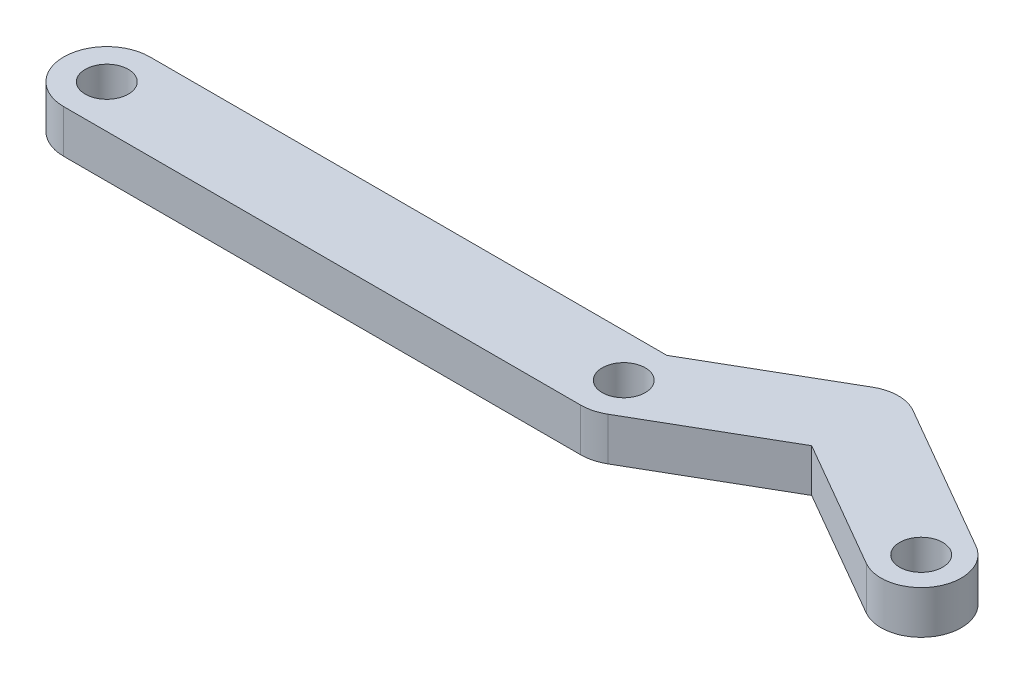
ISO-10303-21;
HEADER;
FILE_DESCRIPTION(('STEP AP214'),'2;1');
FILE_NAME('part.step','',(''),(''),'','','');
FILE_SCHEMA(('AUTOMOTIVE_DESIGN { 1 0 10303 214 1 1 1 1 }'));
ENDSEC;
DATA;
#1=APPLICATION_CONTEXT('core data for automotive mechanical design processes');
#2=APPLICATION_PROTOCOL_DEFINITION('international standard','automotive_design',2000,#1);
#3=PRODUCT_CONTEXT('',#1,'mechanical');
#4=PRODUCT('Part','Part','',(#3));
#5=PRODUCT_RELATED_PRODUCT_CATEGORY('part','',(#4));
#6=PRODUCT_DEFINITION_FORMATION('','',#4);
#7=PRODUCT_DEFINITION_CONTEXT('part definition',#1,'design');
#8=PRODUCT_DEFINITION('design','',#6,#7);
#9=PRODUCT_DEFINITION_SHAPE('','',#8);
#10=(LENGTH_UNIT() NAMED_UNIT(*) SI_UNIT(.MILLI.,.METRE.));
#11=(NAMED_UNIT(*) PLANE_ANGLE_UNIT() SI_UNIT($,.RADIAN.));
#12=(NAMED_UNIT(*) SI_UNIT($,.STERADIAN.) SOLID_ANGLE_UNIT());
#13=UNCERTAINTY_MEASURE_WITH_UNIT(LENGTH_MEASURE(1.E-05),#10,'distance_accuracy_value','');
#14=(GEOMETRIC_REPRESENTATION_CONTEXT(3) GLOBAL_UNCERTAINTY_ASSIGNED_CONTEXT((#13)) GLOBAL_UNIT_ASSIGNED_CONTEXT((#10,
#11,#12)) REPRESENTATION_CONTEXT('',''));
#15=CARTESIAN_POINT('',(0.,0.,0.));
#16=DIRECTION('',(0.,0.,1.));
#17=DIRECTION('',(1.,0.,0.));
#18=AXIS2_PLACEMENT_3D('',#15,#16,#17);
#19=CARTESIAN_POINT('',(22.209729927617,-36.8220934127486,-12.3316193429843));
#20=DIRECTION('',(0.,1.,0.));
#21=DIRECTION('',(0.,0.,1.));
#22=AXIS2_PLACEMENT_3D('',#19,#20,#21);
#23=CYLINDRICAL_SURFACE('',#22,5.92463065701559);
#24=CARTESIAN_POINT('',(22.209729927617,6.35,-12.3316193429843));
#25=DIRECTION('',(0.,1.,0.));
#26=DIRECTION('',(0.,0.,-1.));
#27=AXIS2_PLACEMENT_3D('',#24,#25,#26);
#28=CIRCLE('',#27,5.92463065701559);
#29=CARTESIAN_POINT('',(25.1720452561248,6.35,-17.4624999999999));
#30=VERTEX_POINT('',#29);
#31=CARTESIAN_POINT('',(19.2474145991092,6.35,-17.4624999999999));
#32=VERTEX_POINT('',#31);
#33=EDGE_CURVE('E150',#30,#32,#28,.T.);
#34=ORIENTED_EDGE('',*,*,#33,.F.);
#35=DIRECTION('',(0.,1.,0.));
#36=VECTOR('',#35,1.);
#37=CARTESIAN_POINT('',(25.1720452561248,-36.6598459297023,-17.4624999999999));
#38=LINE('',#37,#36);
#39=CARTESIAN_POINT('',(25.1720452561248,0.,-17.4624999999999));
#40=VERTEX_POINT('',#39);
#41=EDGE_CURVE('E255',#40,#30,#38,.T.);
#42=ORIENTED_EDGE('',*,*,#41,.F.);
#43=CARTESIAN_POINT('',(22.209729927617,0.,-12.3316193429843));
#44=DIRECTION('',(0.,1.,0.));
#45=DIRECTION('',(0.,0.,1.));
#46=AXIS2_PLACEMENT_3D('',#43,#44,#45);
#47=CIRCLE('',#46,5.92463065701559);
#48=CARTESIAN_POINT('',(19.2474145991092,0.,-17.4624999999999));
#49=VERTEX_POINT('',#48);
#50=EDGE_CURVE('E167',#49,#40,#47,.F.);
#51=ORIENTED_EDGE('',*,*,#50,.F.);
#52=DIRECTION('',(0.,1.,0.));
#53=VECTOR('',#52,1.);
#54=CARTESIAN_POINT('',(19.2474145991092,-36.8220934127486,-17.4624999999999));
#55=LINE('',#54,#53);
#56=EDGE_CURVE('E164',#49,#32,#55,.T.);
#57=ORIENTED_EDGE('',*,*,#56,.T.);
#58=EDGE_LOOP('',(#34,#42,#51,#57));
#59=FACE_BOUND('',#58,.T.);
#60=ADVANCED_FACE('F40',(#59),#23,.T.);
#61=CARTESIAN_POINT('',(0.,6.35,0.));
#62=DIRECTION('',(0.,-1.,0.));
#63=DIRECTION('',(0.,0.,-1.));
#64=AXIS2_PLACEMENT_3D('',#61,#62,#63);
#65=CYLINDRICAL_SURFACE('',#64,6.35);
#66=DIRECTION('',(0.,1.,0.));
#67=VECTOR('',#66,1.);
#68=CARTESIAN_POINT('',(3.17499999999997,-36.8220934127486,5.49926131403121));
#69=LINE('',#68,#67);
#70=CARTESIAN_POINT('',(3.17499999999997,0.,5.49926131403121));
#71=VERTEX_POINT('',#70);
#72=CARTESIAN_POINT('',(3.17499999999997,6.35,5.49926131403121));
#73=VERTEX_POINT('',#72);
#74=EDGE_CURVE('E163',#71,#73,#69,.T.);
#75=ORIENTED_EDGE('',*,*,#74,.T.);
#76=CARTESIAN_POINT('',(0.,6.35,0.));
#77=DIRECTION('',(0.,1.,0.));
#78=DIRECTION('',(0.,0.,1.));
#79=AXIS2_PLACEMENT_3D('',#76,#77,#78);
#80=CIRCLE('',#79,6.35);
#81=CARTESIAN_POINT('',(0.,6.35,6.35));
#82=VERTEX_POINT('',#81);
#83=EDGE_CURVE('E149',#82,#73,#80,.T.);
#84=ORIENTED_EDGE('',*,*,#83,.F.);
#85=DIRECTION('',(0.,-1.,0.));
#86=VECTOR('',#85,1.);
#87=CARTESIAN_POINT('',(0.,6.35,6.35));
#88=LINE('',#87,#86);
#89=CARTESIAN_POINT('',(0.,0.,6.35));
#90=VERTEX_POINT('',#89);
#91=EDGE_CURVE('E188',#82,#90,#88,.T.);
#92=ORIENTED_EDGE('',*,*,#91,.T.);
#93=CARTESIAN_POINT('',(0.,0.,0.));
#94=DIRECTION('',(0.,1.,0.));
#95=DIRECTION('',(0.,0.,1.));
#96=AXIS2_PLACEMENT_3D('',#93,#94,#95);
#97=CIRCLE('',#96,6.35);
#98=EDGE_CURVE('E180',#90,#71,#97,.T.);
#99=ORIENTED_EDGE('',*,*,#98,.T.);
#100=EDGE_LOOP('',(#75,#84,#92,#99));
#101=FACE_BOUND('',#100,.T.);
#102=ADVANCED_FACE('F42',(#101),#65,.T.);
#103=CARTESIAN_POINT('',(0.,6.35,0.));
#104=DIRECTION('',(0.,1.,0.));
#105=DIRECTION('',(0.,0.,1.));
#106=AXIS2_PLACEMENT_3D('',#103,#104,#105);
#107=PLANE('',#106);
#108=DIRECTION('',(-0.866025403784438,0.,-0.500000000000002));
#109=VECTOR('',#108,1.);
#110=CARTESIAN_POINT('',(25.1720452561248,6.35,-17.4624999999999));
#111=LINE('',#110,#109);
#112=CARTESIAN_POINT('',(47.1690905122496,6.35,-4.76249999999982));
#113=VERTEX_POINT('',#112);
#114=EDGE_CURVE('E143',#113,#30,#111,.T.);
#115=ORIENTED_EDGE('',*,*,#114,.T.);
#116=ORIENTED_EDGE('',*,*,#33,.T.);
#117=DIRECTION('',(-0.866025403784441,0.,0.499999999999995));
#118=VECTOR('',#117,1.);
#119=CARTESIAN_POINT('',(0.,6.35,-6.35));
#120=LINE('',#119,#118);
#121=CARTESIAN_POINT('',(0.,6.35,-6.35));
#122=VERTEX_POINT('',#121);
#123=EDGE_CURVE('E153',#32,#122,#120,.T.);
#124=ORIENTED_EDGE('',*,*,#123,.T.);
#125=DIRECTION('',(-1.,0.,0.));
#126=VECTOR('',#125,1.);
#127=CARTESIAN_POINT('',(0.,6.35,-6.35));
#128=LINE('',#127,#126);
#129=CARTESIAN_POINT('',(-76.2,6.35,-6.34999999999999));
#130=VERTEX_POINT('',#129);
#131=EDGE_CURVE('E89',#122,#130,#128,.T.);
#132=ORIENTED_EDGE('',*,*,#131,.T.);
#133=CARTESIAN_POINT('',(-76.2,6.35,0.));
#134=DIRECTION('',(0.,1.,0.));
#135=DIRECTION('',(0.,0.,1.));
#136=AXIS2_PLACEMENT_3D('',#133,#134,#135);
#137=CIRCLE('',#136,6.35);
#138=CARTESIAN_POINT('',(-76.2,6.35,6.35000000000001));
#139=VERTEX_POINT('',#138);
#140=EDGE_CURVE('E185',#130,#139,#137,.T.);
#141=ORIENTED_EDGE('',*,*,#140,.T.);
#142=DIRECTION('',(1.,0.,0.));
#143=VECTOR('',#142,1.);
#144=CARTESIAN_POINT('',(0.,6.35,6.35));
#145=LINE('',#144,#143);
#146=EDGE_CURVE('E64',#139,#82,#145,.T.);
#147=ORIENTED_EDGE('',*,*,#146,.T.);
#148=ORIENTED_EDGE('',*,*,#83,.T.);
#149=DIRECTION('',(0.866025403784441,0.,-0.499999999999995));
#150=VECTOR('',#149,1.);
#151=CARTESIAN_POINT('',(3.17499999999997,6.35,5.49926131403121));
#152=LINE('',#151,#150);
#153=CARTESIAN_POINT('',(22.2097299276169,6.35,-5.49044513363025));
#154=VERTEX_POINT('',#153);
#155=EDGE_CURVE('E140',#73,#154,#152,.T.);
#156=ORIENTED_EDGE('',*,*,#155,.T.);
#157=DIRECTION('',(0.866025403784437,0.,0.500000000000002));
#158=VECTOR('',#157,1.);
#159=CARTESIAN_POINT('',(22.2097299276169,6.35,-5.49044513363025));
#160=LINE('',#159,#158);
#161=CARTESIAN_POINT('',(41.2444598552339,6.35,5.49926131403135));
#162=VERTEX_POINT('',#161);
#163=EDGE_CURVE('E126',#154,#162,#160,.T.);
#164=ORIENTED_EDGE('',*,*,#163,.T.);
#165=CARTESIAN_POINT('',(44.2067751837417,6.35,0.368380657015746));
#166=DIRECTION('',(0.,1.,0.));
#167=DIRECTION('',(0.,0.,-1.));
#168=AXIS2_PLACEMENT_3D('',#165,#166,#167);
#169=CIRCLE('',#168,5.92463065701559);
#170=EDGE_CURVE('E133',#162,#113,#169,.T.);
#171=ORIENTED_EDGE('',*,*,#170,.T.);
#172=EDGE_LOOP('',(#115,#116,#124,#132,#141,#147,#148,#156,#164,#171));
#173=FACE_BOUND('',#172,.T.);
#174=CARTESIAN_POINT('',(-76.2,6.35,0.));
#175=DIRECTION('',(0.,1.,0.));
#176=DIRECTION('',(0.,0.,1.));
#177=AXIS2_PLACEMENT_3D('',#174,#175,#176);
#178=CIRCLE('',#177,3.175);
#179=CARTESIAN_POINT('',(-76.2,6.35,3.17500000000001));
#180=VERTEX_POINT('',#179);
#181=EDGE_CURVE('E177',#180,#180,#178,.T.);
#182=ORIENTED_EDGE('',*,*,#181,.F.);
#183=EDGE_LOOP('',(#182));
#184=FACE_BOUND('',#183,.T.);
#185=CARTESIAN_POINT('',(0.,6.35,0.));
#186=DIRECTION('',(0.,1.,0.));
#187=DIRECTION('',(0.,0.,1.));
#188=AXIS2_PLACEMENT_3D('',#185,#186,#187);
#189=CIRCLE('',#188,3.175);
#190=CARTESIAN_POINT('',(0.,6.35,3.175));
#191=VERTEX_POINT('',#190);
#192=EDGE_CURVE('E171',#191,#191,#189,.T.);
#193=ORIENTED_EDGE('',*,*,#192,.F.);
#194=EDGE_LOOP('',(#193));
#195=FACE_BOUND('',#194,.T.);
#196=CARTESIAN_POINT('',(44.2067751837417,6.35,0.368380657015746));
#197=DIRECTION('',(0.,1.,0.));
#198=DIRECTION('',(0.,0.,1.));
#199=AXIS2_PLACEMENT_3D('',#196,#197,#198);
#200=CIRCLE('',#199,3.175);
#201=CARTESIAN_POINT('',(44.2067751837417,6.35,3.54338065701574));
#202=VERTEX_POINT('',#201);
#203=EDGE_CURVE('E134',#202,#202,#200,.T.);
#204=ORIENTED_EDGE('',*,*,#203,.F.);
#205=EDGE_LOOP('',(#204));
#206=FACE_BOUND('',#205,.T.);
#207=ADVANCED_FACE('F146',(#173,#184,#195,#206),#107,.T.);
#208=CARTESIAN_POINT('',(0.,0.,0.));
#209=DIRECTION('',(0.,1.,0.));
#210=DIRECTION('',(0.,0.,1.));
#211=AXIS2_PLACEMENT_3D('',#208,#209,#210);
#212=PLANE('',#211);
#213=ORIENTED_EDGE('',*,*,#50,.T.);
#214=DIRECTION('',(0.866025403784438,0.,0.500000000000002));
#215=VECTOR('',#214,1.);
#216=CARTESIAN_POINT('',(25.1720452561248,0.,-17.4624999999999));
#217=LINE('',#216,#215);
#218=CARTESIAN_POINT('',(47.1690905122496,0.,-4.76249999999982));
#219=VERTEX_POINT('',#218);
#220=EDGE_CURVE('E156',#40,#219,#217,.T.);
#221=ORIENTED_EDGE('',*,*,#220,.T.);
#222=CARTESIAN_POINT('',(44.2067751837417,0.,0.368380657015746));
#223=DIRECTION('',(0.,1.,0.));
#224=DIRECTION('',(0.,0.,1.));
#225=AXIS2_PLACEMENT_3D('',#222,#223,#224);
#226=CIRCLE('',#225,5.92463065701559);
#227=CARTESIAN_POINT('',(41.2444598552339,0.,5.49926131403135));
#228=VERTEX_POINT('',#227);
#229=EDGE_CURVE('E267',#219,#228,#226,.F.);
#230=ORIENTED_EDGE('',*,*,#229,.T.);
#231=DIRECTION('',(-0.866025403784437,0.,-0.500000000000002));
#232=VECTOR('',#231,1.);
#233=CARTESIAN_POINT('',(22.2097299276169,0.,-5.49044513363025));
#234=LINE('',#233,#232);
#235=CARTESIAN_POINT('',(22.2097299276169,0.,-5.49044513363012));
#236=VERTEX_POINT('',#235);
#237=EDGE_CURVE('E261',#228,#236,#234,.T.);
#238=ORIENTED_EDGE('',*,*,#237,.T.);
#239=DIRECTION('',(-0.866025403784441,0.,0.499999999999995));
#240=VECTOR('',#239,1.);
#241=CARTESIAN_POINT('',(3.17499999999997,0.,5.49926131403121));
#242=LINE('',#241,#240);
#243=EDGE_CURVE('E142',#236,#71,#242,.T.);
#244=ORIENTED_EDGE('',*,*,#243,.T.);
#245=ORIENTED_EDGE('',*,*,#98,.F.);
#246=DIRECTION('',(1.,0.,0.));
#247=VECTOR('',#246,1.);
#248=CARTESIAN_POINT('',(0.,0.,6.35));
#249=LINE('',#248,#247);
#250=CARTESIAN_POINT('',(-76.2,0.,6.35000000000001));
#251=VERTEX_POINT('',#250);
#252=EDGE_CURVE('E84',#251,#90,#249,.T.);
#253=ORIENTED_EDGE('',*,*,#252,.F.);
#254=CARTESIAN_POINT('',(-76.2,0.,0.));
#255=DIRECTION('',(0.,1.,0.));
#256=DIRECTION('',(0.,0.,1.));
#257=AXIS2_PLACEMENT_3D('',#254,#255,#256);
#258=CIRCLE('',#257,6.35);
#259=CARTESIAN_POINT('',(-76.2,0.,-6.34999999999999));
#260=VERTEX_POINT('',#259);
#261=EDGE_CURVE('E193',#260,#251,#258,.T.);
#262=ORIENTED_EDGE('',*,*,#261,.F.);
#263=DIRECTION('',(-1.,0.,0.));
#264=VECTOR('',#263,1.);
#265=CARTESIAN_POINT('',(0.,0.,-6.35));
#266=LINE('',#265,#264);
#267=CARTESIAN_POINT('',(0.,0.,-6.35));
#268=VERTEX_POINT('',#267);
#269=EDGE_CURVE('E191',#268,#260,#266,.T.);
#270=ORIENTED_EDGE('',*,*,#269,.F.);
#271=DIRECTION('',(0.866025403784442,0.,-0.499999999999995));
#272=VECTOR('',#271,1.);
#273=CARTESIAN_POINT('',(0.,0.,-6.35));
#274=LINE('',#273,#272);
#275=EDGE_CURVE('E159',#268,#49,#274,.T.);
#276=ORIENTED_EDGE('',*,*,#275,.T.);
#277=EDGE_LOOP('',(#213,#221,#230,#238,#244,#245,#253,#262,#270,#276));
#278=FACE_BOUND('',#277,.T.);
#279=CARTESIAN_POINT('',(-76.2,0.,0.));
#280=DIRECTION('',(0.,1.,0.));
#281=DIRECTION('',(0.,0.,1.));
#282=AXIS2_PLACEMENT_3D('',#279,#280,#281);
#283=CIRCLE('',#282,3.175);
#284=CARTESIAN_POINT('',(-76.2,0.,3.17500000000001));
#285=VERTEX_POINT('',#284);
#286=EDGE_CURVE('E174',#285,#285,#283,.T.);
#287=ORIENTED_EDGE('',*,*,#286,.T.);
#288=EDGE_LOOP('',(#287));
#289=FACE_BOUND('',#288,.T.);
#290=CARTESIAN_POINT('',(0.,0.,0.));
#291=DIRECTION('',(0.,1.,0.));
#292=DIRECTION('',(0.,0.,1.));
#293=AXIS2_PLACEMENT_3D('',#290,#291,#292);
#294=CIRCLE('',#293,3.175);
#295=CARTESIAN_POINT('',(0.,0.,3.175));
#296=VERTEX_POINT('',#295);
#297=EDGE_CURVE('E170',#296,#296,#294,.T.);
#298=ORIENTED_EDGE('',*,*,#297,.T.);
#299=EDGE_LOOP('',(#298));
#300=FACE_BOUND('',#299,.T.);
#301=CARTESIAN_POINT('',(44.2067751837417,0.,0.368380657015746));
#302=DIRECTION('',(0.,1.,0.));
#303=DIRECTION('',(0.,0.,1.));
#304=AXIS2_PLACEMENT_3D('',#301,#302,#303);
#305=CIRCLE('',#304,3.175);
#306=CARTESIAN_POINT('',(44.2067751837417,0.,3.54338065701574));
#307=VERTEX_POINT('',#306);
#308=EDGE_CURVE('E151',#307,#307,#305,.F.);
#309=ORIENTED_EDGE('',*,*,#308,.F.);
#310=EDGE_LOOP('',(#309));
#311=FACE_BOUND('',#310,.T.);
#312=ADVANCED_FACE('F208',(#278,#289,#300,#311),#212,.F.);
#313=CARTESIAN_POINT('',(0.,6.35,-6.35));
#314=DIRECTION('',(0.,0.,1.));
#315=DIRECTION('',(1.,0.,0.));
#316=AXIS2_PLACEMENT_3D('',#313,#314,#315);
#317=PLANE('',#316);
#318=ORIENTED_EDGE('',*,*,#269,.T.);
#319=DIRECTION('',(0.,-1.,0.));
#320=VECTOR('',#319,1.);
#321=CARTESIAN_POINT('',(-76.2,6.35,-6.34999999999999));
#322=LINE('',#321,#320);
#323=EDGE_CURVE('E48',#130,#260,#322,.T.);
#324=ORIENTED_EDGE('',*,*,#323,.F.);
#325=ORIENTED_EDGE('',*,*,#131,.F.);
#326=DIRECTION('',(0.,-1.,0.));
#327=VECTOR('',#326,1.);
#328=CARTESIAN_POINT('',(0.,6.35,-6.35));
#329=LINE('',#328,#327);
#330=EDGE_CURVE('E11',#122,#268,#329,.T.);
#331=ORIENTED_EDGE('',*,*,#330,.T.);
#332=EDGE_LOOP('',(#318,#324,#325,#331));
#333=FACE_BOUND('',#332,.T.);
#334=ADVANCED_FACE('F223',(#333),#317,.F.);
#335=CARTESIAN_POINT('',(-76.2,6.35,0.));
#336=DIRECTION('',(0.,-1.,0.));
#337=DIRECTION('',(0.,0.,-1.));
#338=AXIS2_PLACEMENT_3D('',#335,#336,#337);
#339=CYLINDRICAL_SURFACE('',#338,6.35);
#340=ORIENTED_EDGE('',*,*,#261,.T.);
#341=DIRECTION('',(0.,-1.,0.));
#342=VECTOR('',#341,1.);
#343=CARTESIAN_POINT('',(-76.2,6.35,6.35000000000001));
#344=LINE('',#343,#342);
#345=EDGE_CURVE('E197',#139,#251,#344,.T.);
#346=ORIENTED_EDGE('',*,*,#345,.F.);
#347=ORIENTED_EDGE('',*,*,#140,.F.);
#348=ORIENTED_EDGE('',*,*,#323,.T.);
#349=EDGE_LOOP('',(#340,#346,#347,#348));
#350=FACE_BOUND('',#349,.T.);
#351=ADVANCED_FACE('F202',(#350),#339,.T.);
#352=CARTESIAN_POINT('',(0.,6.35,6.35));
#353=DIRECTION('',(0.,0.,-1.));
#354=DIRECTION('',(-1.,0.,0.));
#355=AXIS2_PLACEMENT_3D('',#352,#353,#354);
#356=PLANE('',#355);
#357=ORIENTED_EDGE('',*,*,#252,.T.);
#358=ORIENTED_EDGE('',*,*,#91,.F.);
#359=ORIENTED_EDGE('',*,*,#146,.F.);
#360=ORIENTED_EDGE('',*,*,#345,.T.);
#361=EDGE_LOOP('',(#357,#358,#359,#360));
#362=FACE_BOUND('',#361,.T.);
#363=ADVANCED_FACE('F212',(#362),#356,.F.);
#364=CARTESIAN_POINT('',(-76.2,6.35,0.));
#365=DIRECTION('',(0.,-1.,0.));
#366=DIRECTION('',(0.,0.,-1.));
#367=AXIS2_PLACEMENT_3D('',#364,#365,#366);
#368=CYLINDRICAL_SURFACE('',#367,3.175);
#369=ORIENTED_EDGE('',*,*,#181,.T.);
#370=EDGE_LOOP('',(#369));
#371=FACE_BOUND('',#370,.T.);
#372=ORIENTED_EDGE('',*,*,#286,.F.);
#373=EDGE_LOOP('',(#372));
#374=FACE_BOUND('',#373,.T.);
#375=ADVANCED_FACE('F214',(#371,#374),#368,.F.);
#376=CARTESIAN_POINT('',(0.,6.35,0.));
#377=DIRECTION('',(0.,-1.,0.));
#378=DIRECTION('',(0.,0.,-1.));
#379=AXIS2_PLACEMENT_3D('',#376,#377,#378);
#380=CYLINDRICAL_SURFACE('',#379,3.175);
#381=ORIENTED_EDGE('',*,*,#192,.T.);
#382=EDGE_LOOP('',(#381));
#383=FACE_BOUND('',#382,.T.);
#384=ORIENTED_EDGE('',*,*,#297,.F.);
#385=EDGE_LOOP('',(#384));
#386=FACE_BOUND('',#385,.T.);
#387=ADVANCED_FACE('F220',(#383,#386),#380,.F.);
#388=CARTESIAN_POINT('',(0.,-36.8220934127486,-6.35));
#389=DIRECTION('',(-0.499999999999995,0.,-0.866025403784441));
#390=DIRECTION('',(-0.866025403784442,0.,0.499999999999995));
#391=AXIS2_PLACEMENT_3D('',#388,#389,#390);
#392=PLANE('',#391);
#393=ORIENTED_EDGE('',*,*,#275,.F.);
#394=ORIENTED_EDGE('',*,*,#330,.F.);
#395=ORIENTED_EDGE('',*,*,#123,.F.);
#396=ORIENTED_EDGE('',*,*,#56,.F.);
#397=EDGE_LOOP('',(#393,#394,#395,#396));
#398=FACE_BOUND('',#397,.T.);
#399=ADVANCED_FACE('F235',(#398),#392,.T.);
#400=CARTESIAN_POINT('',(3.17499999999997,-36.8220934127486,5.49926131403121));
#401=DIRECTION('',(0.499999999999995,0.,0.866025403784441));
#402=DIRECTION('',(0.866025403784441,0.,-0.499999999999995));
#403=AXIS2_PLACEMENT_3D('',#400,#401,#402);
#404=PLANE('',#403);
#405=DIRECTION('',(0.,1.,0.));
#406=VECTOR('',#405,1.);
#407=CARTESIAN_POINT('',(22.2097299276169,-36.6598459297023,-5.49044513363025));
#408=LINE('',#407,#406);
#409=EDGE_CURVE('E55',#236,#154,#408,.T.);
#410=ORIENTED_EDGE('',*,*,#409,.T.);
#411=ORIENTED_EDGE('',*,*,#155,.F.);
#412=ORIENTED_EDGE('',*,*,#74,.F.);
#413=ORIENTED_EDGE('',*,*,#243,.F.);
#414=EDGE_LOOP('',(#410,#411,#412,#413));
#415=FACE_BOUND('',#414,.T.);
#416=ADVANCED_FACE('F138',(#415),#404,.T.);
#417=CARTESIAN_POINT('',(22.2097299276169,-36.6598459297023,-5.49044513363025));
#418=DIRECTION('',(-0.500000000000002,0.,0.866025403784437));
#419=DIRECTION('',(0.866025403784437,0.,0.500000000000002));
#420=AXIS2_PLACEMENT_3D('',#417,#418,#419);
#421=PLANE('',#420);
#422=ORIENTED_EDGE('',*,*,#237,.F.);
#423=DIRECTION('',(0.,1.,0.));
#424=VECTOR('',#423,1.);
#425=CARTESIAN_POINT('',(41.2444598552339,-36.6598459297023,5.49926131403135));
#426=LINE('',#425,#424);
#427=EDGE_CURVE('E129',#228,#162,#426,.T.);
#428=ORIENTED_EDGE('',*,*,#427,.T.);
#429=ORIENTED_EDGE('',*,*,#163,.F.);
#430=ORIENTED_EDGE('',*,*,#409,.F.);
#431=EDGE_LOOP('',(#422,#428,#429,#430));
#432=FACE_BOUND('',#431,.T.);
#433=ADVANCED_FACE('F127',(#432),#421,.T.);
#434=CARTESIAN_POINT('',(44.2067751837417,-36.6598459297023,0.368380657015746));
#435=DIRECTION('',(0.,1.,0.));
#436=DIRECTION('',(0.,0.,1.));
#437=AXIS2_PLACEMENT_3D('',#434,#435,#436);
#438=CYLINDRICAL_SURFACE('',#437,5.92463065701559);
#439=ORIENTED_EDGE('',*,*,#229,.F.);
#440=DIRECTION('',(0.,1.,0.));
#441=VECTOR('',#440,1.);
#442=CARTESIAN_POINT('',(47.1690905122496,-36.6598459297023,-4.76249999999982));
#443=LINE('',#442,#441);
#444=EDGE_CURVE('E258',#219,#113,#443,.T.);
#445=ORIENTED_EDGE('',*,*,#444,.T.);
#446=ORIENTED_EDGE('',*,*,#170,.F.);
#447=ORIENTED_EDGE('',*,*,#427,.F.);
#448=EDGE_LOOP('',(#439,#445,#446,#447));
#449=FACE_BOUND('',#448,.T.);
#450=ADVANCED_FACE('F271',(#449),#438,.T.);
#451=CARTESIAN_POINT('',(25.1720452561248,-36.6598459297023,-17.4624999999999));
#452=DIRECTION('',(0.500000000000002,0.,-0.866025403784438));
#453=DIRECTION('',(-0.866025403784438,0.,-0.500000000000002));
#454=AXIS2_PLACEMENT_3D('',#451,#452,#453);
#455=PLANE('',#454);
#456=ORIENTED_EDGE('',*,*,#220,.F.);
#457=ORIENTED_EDGE('',*,*,#41,.T.);
#458=ORIENTED_EDGE('',*,*,#114,.F.);
#459=ORIENTED_EDGE('',*,*,#444,.F.);
#460=EDGE_LOOP('',(#456,#457,#458,#459));
#461=FACE_BOUND('',#460,.T.);
#462=ADVANCED_FACE('F274',(#461),#455,.T.);
#463=CARTESIAN_POINT('',(44.2067751837417,-36.6598459297023,0.368380657015746));
#464=DIRECTION('',(0.,1.,0.));
#465=DIRECTION('',(0.,0.,1.));
#466=AXIS2_PLACEMENT_3D('',#463,#464,#465);
#467=CYLINDRICAL_SURFACE('',#466,3.175);
#468=ORIENTED_EDGE('',*,*,#308,.T.);
#469=EDGE_LOOP('',(#468));
#470=FACE_BOUND('',#469,.T.);
#471=ORIENTED_EDGE('',*,*,#203,.T.);
#472=EDGE_LOOP('',(#471));
#473=FACE_BOUND('',#472,.T.);
#474=ADVANCED_FACE('F276',(#470,#473),#467,.F.);
#475=CLOSED_SHELL('',(#60,#102,#207,#312,#334,#351,#363,#375,#387,#399,#416,#433,#450,#462,#474));
#476=MANIFOLD_SOLID_BREP('B2',#475);
#477=ADVANCED_BREP_SHAPE_REPRESENTATION('',(#18,#476),#14);
#478=SHAPE_DEFINITION_REPRESENTATION(#9,#477);
ENDSEC;
END-ISO-10303-21;
